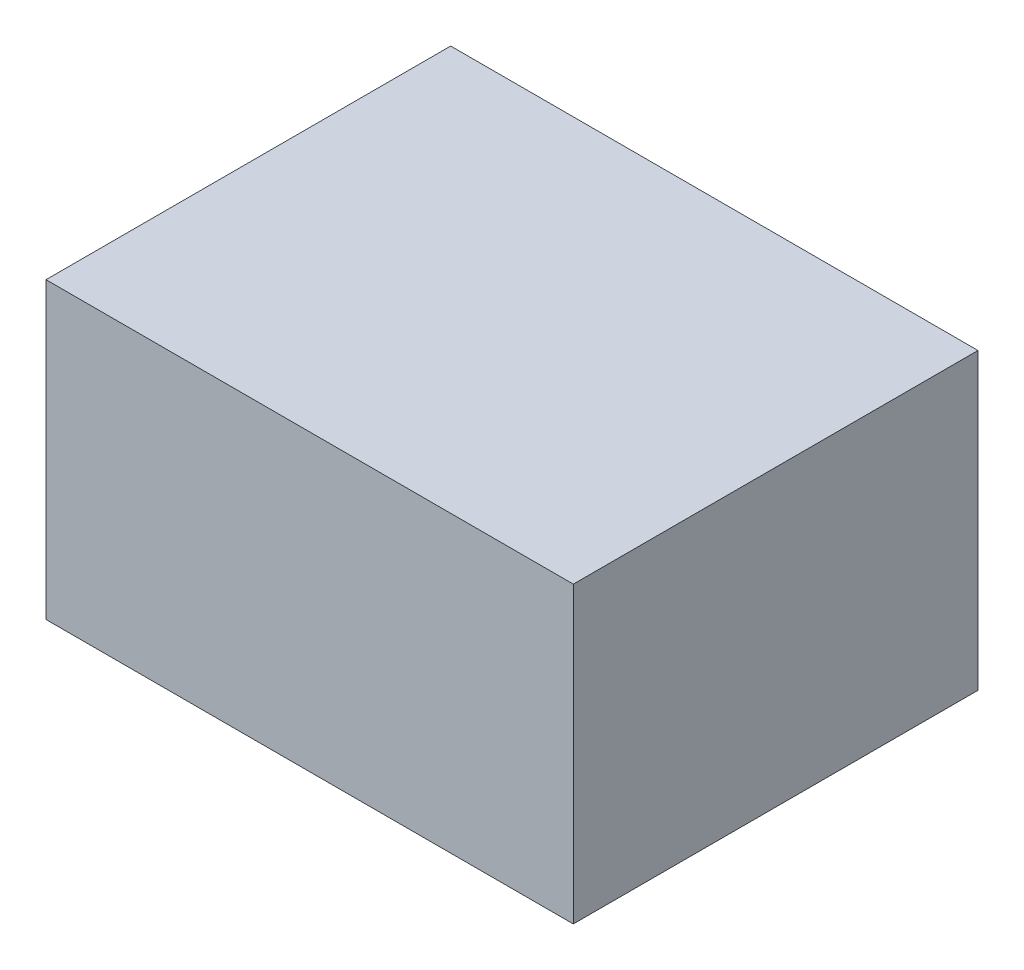
ISO-10303-21;
HEADER;
FILE_DESCRIPTION(('STEP AP214'),'2;1');
FILE_NAME('part.step','',(''),(''),'','','');
FILE_SCHEMA(('AUTOMOTIVE_DESIGN { 1 0 10303 214 1 1 1 1 }'));
ENDSEC;
DATA;
#1=APPLICATION_CONTEXT('core data for automotive mechanical design processes');
#2=APPLICATION_PROTOCOL_DEFINITION('international standard','automotive_design',2000,#1);
#3=PRODUCT_CONTEXT('',#1,'mechanical');
#4=PRODUCT('Part','Part','',(#3));
#5=PRODUCT_RELATED_PRODUCT_CATEGORY('part','',(#4));
#6=PRODUCT_DEFINITION_FORMATION('','',#4);
#7=PRODUCT_DEFINITION_CONTEXT('part definition',#1,'design');
#8=PRODUCT_DEFINITION('design','',#6,#7);
#9=PRODUCT_DEFINITION_SHAPE('','',#8);
#10=(LENGTH_UNIT() NAMED_UNIT(*) SI_UNIT(.MILLI.,.METRE.));
#11=(NAMED_UNIT(*) PLANE_ANGLE_UNIT() SI_UNIT($,.RADIAN.));
#12=(NAMED_UNIT(*) SI_UNIT($,.STERADIAN.) SOLID_ANGLE_UNIT());
#13=UNCERTAINTY_MEASURE_WITH_UNIT(LENGTH_MEASURE(1.E-05),#10,'distance_accuracy_value','');
#14=(GEOMETRIC_REPRESENTATION_CONTEXT(3) GLOBAL_UNCERTAINTY_ASSIGNED_CONTEXT((#13)) GLOBAL_UNIT_ASSIGNED_CONTEXT((#10,
#11,#12)) REPRESENTATION_CONTEXT('',''));
#15=CARTESIAN_POINT('',(0.,0.,0.));
#16=DIRECTION('',(0.,0.,1.));
#17=DIRECTION('',(1.,0.,0.));
#18=AXIS2_PLACEMENT_3D('',#15,#16,#17);
#19=CARTESIAN_POINT('',(-21.5,92.57,16.5));
#20=DIRECTION('',(1.,0.,0.));
#21=DIRECTION('',(0.,0.,-1.));
#22=AXIS2_PLACEMENT_3D('',#19,#20,#21);
#23=PLANE('',#22);
#24=DIRECTION('',(0.,0.,1.));
#25=VECTOR('',#24,1.);
#26=CARTESIAN_POINT('',(-21.5,68.57,16.5));
#27=LINE('',#26,#25);
#28=CARTESIAN_POINT('',(-21.5,68.57,-16.5));
#29=VERTEX_POINT('',#28);
#30=CARTESIAN_POINT('',(-21.5,68.57,16.5));
#31=VERTEX_POINT('',#30);
#32=EDGE_CURVE('E101',#29,#31,#27,.T.);
#33=ORIENTED_EDGE('',*,*,#32,.T.);
#34=DIRECTION('',(0.,-1.,0.));
#35=VECTOR('',#34,1.);
#36=CARTESIAN_POINT('',(-21.5,92.57,16.5));
#37=LINE('',#36,#35);
#38=CARTESIAN_POINT('',(-21.5,92.57,16.5));
#39=VERTEX_POINT('',#38);
#40=EDGE_CURVE('E11',#39,#31,#37,.T.);
#41=ORIENTED_EDGE('',*,*,#40,.F.);
#42=DIRECTION('',(0.,0.,1.));
#43=VECTOR('',#42,1.);
#44=CARTESIAN_POINT('',(-21.5,92.57,16.5));
#45=LINE('',#44,#43);
#46=CARTESIAN_POINT('',(-21.5,92.57,-16.5));
#47=VERTEX_POINT('',#46);
#48=EDGE_CURVE('E95',#47,#39,#45,.T.);
#49=ORIENTED_EDGE('',*,*,#48,.F.);
#50=DIRECTION('',(0.,-1.,0.));
#51=VECTOR('',#50,1.);
#52=CARTESIAN_POINT('',(-21.5,92.57,-16.5));
#53=LINE('',#52,#51);
#54=EDGE_CURVE('E99',#47,#29,#53,.T.);
#55=ORIENTED_EDGE('',*,*,#54,.T.);
#56=EDGE_LOOP('',(#33,#41,#49,#55));
#57=FACE_BOUND('',#56,.T.);
#58=ADVANCED_FACE('F41',(#57),#23,.F.);
#59=CARTESIAN_POINT('',(21.5,92.57,16.5));
#60=DIRECTION('',(0.,0.,-1.));
#61=DIRECTION('',(-1.,0.,0.));
#62=AXIS2_PLACEMENT_3D('',#59,#60,#61);
#63=PLANE('',#62);
#64=DIRECTION('',(1.,0.,0.));
#65=VECTOR('',#64,1.);
#66=CARTESIAN_POINT('',(21.5,68.57,16.5));
#67=LINE('',#66,#65);
#68=CARTESIAN_POINT('',(21.5,68.57,16.5));
#69=VERTEX_POINT('',#68);
#70=EDGE_CURVE('E96',#31,#69,#67,.T.);
#71=ORIENTED_EDGE('',*,*,#70,.T.);
#72=DIRECTION('',(0.,-1.,0.));
#73=VECTOR('',#72,1.);
#74=CARTESIAN_POINT('',(21.5,92.57,16.5));
#75=LINE('',#74,#73);
#76=CARTESIAN_POINT('',(21.5,92.57,16.5));
#77=VERTEX_POINT('',#76);
#78=EDGE_CURVE('E47',#77,#69,#75,.T.);
#79=ORIENTED_EDGE('',*,*,#78,.F.);
#80=DIRECTION('',(1.,0.,0.));
#81=VECTOR('',#80,1.);
#82=CARTESIAN_POINT('',(21.5,92.57,16.5));
#83=LINE('',#82,#81);
#84=EDGE_CURVE('E90',#39,#77,#83,.T.);
#85=ORIENTED_EDGE('',*,*,#84,.F.);
#86=ORIENTED_EDGE('',*,*,#40,.T.);
#87=EDGE_LOOP('',(#71,#79,#85,#86));
#88=FACE_BOUND('',#87,.T.);
#89=ADVANCED_FACE('F94',(#88),#63,.F.);
#90=CARTESIAN_POINT('',(21.5,92.57,-16.5));
#91=DIRECTION('',(-1.,0.,0.));
#92=DIRECTION('',(0.,0.,1.));
#93=AXIS2_PLACEMENT_3D('',#90,#91,#92);
#94=PLANE('',#93);
#95=DIRECTION('',(0.,0.,-1.));
#96=VECTOR('',#95,1.);
#97=CARTESIAN_POINT('',(21.5,68.57,-16.5));
#98=LINE('',#97,#96);
#99=CARTESIAN_POINT('',(21.5,68.57,-16.5));
#100=VERTEX_POINT('',#99);
#101=EDGE_CURVE('E74',#69,#100,#98,.T.);
#102=ORIENTED_EDGE('',*,*,#101,.T.);
#103=DIRECTION('',(0.,-1.,0.));
#104=VECTOR('',#103,1.);
#105=CARTESIAN_POINT('',(21.5,92.57,-16.5));
#106=LINE('',#105,#104);
#107=CARTESIAN_POINT('',(21.5,92.57,-16.5));
#108=VERTEX_POINT('',#107);
#109=EDGE_CURVE('E100',#108,#100,#106,.T.);
#110=ORIENTED_EDGE('',*,*,#109,.F.);
#111=DIRECTION('',(0.,0.,-1.));
#112=VECTOR('',#111,1.);
#113=CARTESIAN_POINT('',(21.5,92.57,-16.5));
#114=LINE('',#113,#112);
#115=EDGE_CURVE('E89',#77,#108,#114,.T.);
#116=ORIENTED_EDGE('',*,*,#115,.F.);
#117=ORIENTED_EDGE('',*,*,#78,.T.);
#118=EDGE_LOOP('',(#102,#110,#116,#117));
#119=FACE_BOUND('',#118,.T.);
#120=ADVANCED_FACE('F97',(#119),#94,.F.);
#121=CARTESIAN_POINT('',(-21.5,92.57,-16.5));
#122=DIRECTION('',(0.,0.,1.));
#123=DIRECTION('',(1.,0.,0.));
#124=AXIS2_PLACEMENT_3D('',#121,#122,#123);
#125=PLANE('',#124);
#126=DIRECTION('',(-1.,0.,0.));
#127=VECTOR('',#126,1.);
#128=CARTESIAN_POINT('',(-21.5,68.57,-16.5));
#129=LINE('',#128,#127);
#130=EDGE_CURVE('E79',#100,#29,#129,.T.);
#131=ORIENTED_EDGE('',*,*,#130,.T.);
#132=ORIENTED_EDGE('',*,*,#54,.F.);
#133=DIRECTION('',(-1.,0.,0.));
#134=VECTOR('',#133,1.);
#135=CARTESIAN_POINT('',(-21.5,92.57,-16.5));
#136=LINE('',#135,#134);
#137=EDGE_CURVE('E60',#108,#47,#136,.T.);
#138=ORIENTED_EDGE('',*,*,#137,.F.);
#139=ORIENTED_EDGE('',*,*,#109,.T.);
#140=EDGE_LOOP('',(#131,#132,#138,#139));
#141=FACE_BOUND('',#140,.T.);
#142=ADVANCED_FACE('F112',(#141),#125,.F.);
#143=CARTESIAN_POINT('',(0.,92.57,0.));
#144=DIRECTION('',(0.,-1.,0.));
#145=DIRECTION('',(0.,0.,-1.));
#146=AXIS2_PLACEMENT_3D('',#143,#144,#145);
#147=PLANE('',#146);
#148=ORIENTED_EDGE('',*,*,#48,.T.);
#149=ORIENTED_EDGE('',*,*,#84,.T.);
#150=ORIENTED_EDGE('',*,*,#115,.T.);
#151=ORIENTED_EDGE('',*,*,#137,.T.);
#152=EDGE_LOOP('',(#148,#149,#150,#151));
#153=FACE_BOUND('',#152,.T.);
#154=ADVANCED_FACE('F88',(#153),#147,.F.);
#155=CARTESIAN_POINT('',(0.,68.57,0.));
#156=DIRECTION('',(0.,-1.,0.));
#157=DIRECTION('',(0.,0.,-1.));
#158=AXIS2_PLACEMENT_3D('',#155,#156,#157);
#159=PLANE('',#158);
#160=ORIENTED_EDGE('',*,*,#32,.F.);
#161=ORIENTED_EDGE('',*,*,#130,.F.);
#162=ORIENTED_EDGE('',*,*,#101,.F.);
#163=ORIENTED_EDGE('',*,*,#70,.F.);
#164=EDGE_LOOP('',(#160,#161,#162,#163));
#165=FACE_BOUND('',#164,.T.);
#166=ADVANCED_FACE('F114',(#165),#159,.T.);
#167=CLOSED_SHELL('',(#58,#89,#120,#142,#154,#166));
#168=MANIFOLD_SOLID_BREP('B2',#167);
#169=ADVANCED_BREP_SHAPE_REPRESENTATION('',(#18,#168),#14);
#170=SHAPE_DEFINITION_REPRESENTATION(#9,#169);
ENDSEC;
END-ISO-10303-21;
